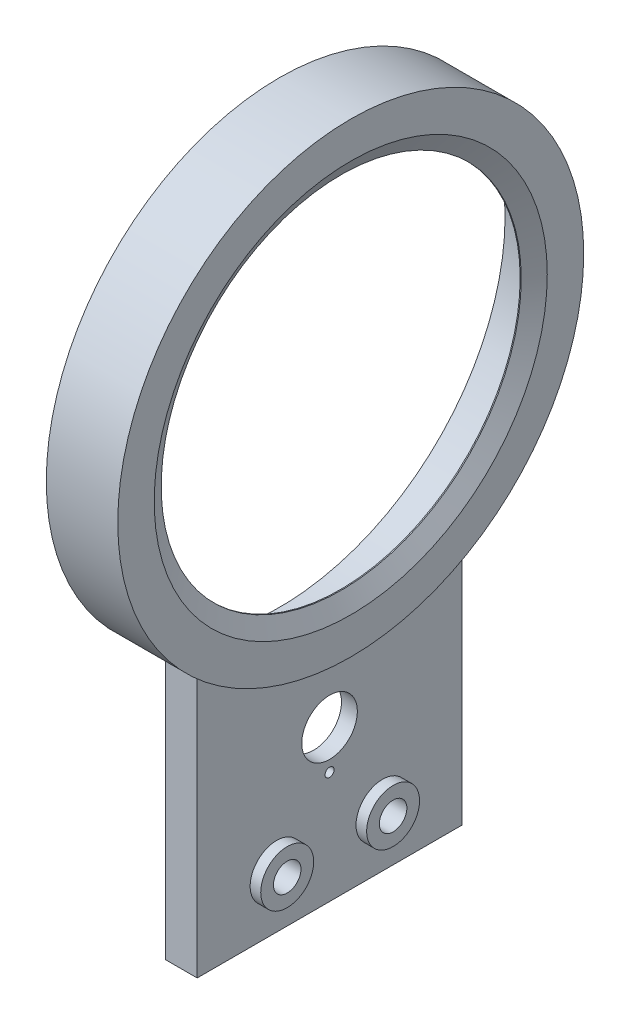
ISO-10303-21;
HEADER;
FILE_DESCRIPTION(('STEP AP214'),'2;1');
FILE_NAME('part.step','',(''),(''),'','','');
FILE_SCHEMA(('AUTOMOTIVE_DESIGN { 1 0 10303 214 1 1 1 1 }'));
ENDSEC;
DATA;
#1=APPLICATION_CONTEXT('core data for automotive mechanical design processes');
#2=APPLICATION_PROTOCOL_DEFINITION('international standard','automotive_design',2000,#1);
#3=PRODUCT_CONTEXT('',#1,'mechanical');
#4=PRODUCT('Part','Part','',(#3));
#5=PRODUCT_RELATED_PRODUCT_CATEGORY('part','',(#4));
#6=PRODUCT_DEFINITION_FORMATION('','',#4);
#7=PRODUCT_DEFINITION_CONTEXT('part definition',#1,'design');
#8=PRODUCT_DEFINITION('design','',#6,#7);
#9=PRODUCT_DEFINITION_SHAPE('','',#8);
#10=(LENGTH_UNIT() NAMED_UNIT(*) SI_UNIT(.MILLI.,.METRE.));
#11=(NAMED_UNIT(*) PLANE_ANGLE_UNIT() SI_UNIT($,.RADIAN.));
#12=(NAMED_UNIT(*) SI_UNIT($,.STERADIAN.) SOLID_ANGLE_UNIT());
#13=UNCERTAINTY_MEASURE_WITH_UNIT(LENGTH_MEASURE(1.E-05),#10,'distance_accuracy_value','');
#14=(GEOMETRIC_REPRESENTATION_CONTEXT(3) GLOBAL_UNCERTAINTY_ASSIGNED_CONTEXT((#13)) GLOBAL_UNIT_ASSIGNED_CONTEXT((#10,
#11,#12)) REPRESENTATION_CONTEXT('',''));
#15=CARTESIAN_POINT('',(0.,0.,0.));
#16=DIRECTION('',(0.,0.,1.));
#17=DIRECTION('',(1.,0.,0.));
#18=AXIS2_PLACEMENT_3D('',#15,#16,#17);
#19=CARTESIAN_POINT('',(-12.,-64.86,0.));
#20=DIRECTION('',(1.,0.,0.));
#21=DIRECTION('',(0.,0.,-1.));
#22=AXIS2_PLACEMENT_3D('',#19,#20,#21);
#23=CYLINDRICAL_SURFACE('',#22,0.850000000000002);
#24=CARTESIAN_POINT('',(-2.,-64.86,0.));
#25=DIRECTION('',(1.,0.,0.));
#26=DIRECTION('',(0.,0.,-1.));
#27=AXIS2_PLACEMENT_3D('',#24,#25,#26);
#28=CIRCLE('',#27,0.850000000000002);
#29=CARTESIAN_POINT('',(-2.,-64.86,-0.85000000000001));
#30=VERTEX_POINT('',#29);
#31=EDGE_CURVE('E161',#30,#30,#28,.T.);
#32=ORIENTED_EDGE('',*,*,#31,.T.);
#33=EDGE_LOOP('',(#32));
#34=FACE_BOUND('',#33,.T.);
#35=CARTESIAN_POINT('',(-5.,-64.86,0.));
#36=DIRECTION('',(-1.,0.,0.));
#37=DIRECTION('',(0.,0.,1.));
#38=AXIS2_PLACEMENT_3D('',#35,#36,#37);
#39=CIRCLE('',#38,0.850000000000002);
#40=CARTESIAN_POINT('',(-5.,-64.86,0.849999999999994));
#41=VERTEX_POINT('',#40);
#42=EDGE_CURVE('E137',#41,#41,#39,.F.);
#43=ORIENTED_EDGE('',*,*,#42,.F.);
#44=EDGE_LOOP('',(#43));
#45=FACE_BOUND('',#44,.T.);
#46=ADVANCED_FACE('F43',(#34,#45),#23,.F.);
#47=CARTESIAN_POINT('',(-12.,-57.5,0.));
#48=DIRECTION('',(1.,0.,0.));
#49=DIRECTION('',(0.,0.,-1.));
#50=AXIS2_PLACEMENT_3D('',#47,#48,#49);
#51=CYLINDRICAL_SURFACE('',#50,5.25);
#52=CARTESIAN_POINT('',(-2.,-57.5,0.));
#53=DIRECTION('',(1.,0.,0.));
#54=DIRECTION('',(0.,0.,-1.));
#55=AXIS2_PLACEMENT_3D('',#52,#53,#54);
#56=CIRCLE('',#55,5.25);
#57=CARTESIAN_POINT('',(-2.,-57.5,-5.25000000000001));
#58=VERTEX_POINT('',#57);
#59=EDGE_CURVE('E157',#58,#58,#56,.T.);
#60=ORIENTED_EDGE('',*,*,#59,.T.);
#61=EDGE_LOOP('',(#60));
#62=FACE_BOUND('',#61,.T.);
#63=CARTESIAN_POINT('',(-5.,-57.5,0.));
#64=DIRECTION('',(-1.,0.,0.));
#65=DIRECTION('',(0.,0.,1.));
#66=AXIS2_PLACEMENT_3D('',#63,#64,#65);
#67=CIRCLE('',#66,5.25);
#68=CARTESIAN_POINT('',(-5.,-57.5,5.24999999999999));
#69=VERTEX_POINT('',#68);
#70=EDGE_CURVE('E134',#69,#69,#67,.F.);
#71=ORIENTED_EDGE('',*,*,#70,.F.);
#72=EDGE_LOOP('',(#71));
#73=FACE_BOUND('',#72,.T.);
#74=ADVANCED_FACE('F179',(#62,#73),#51,.F.);
#75=CARTESIAN_POINT('',(0.,0.,0.));
#76=DIRECTION('',(1.,0.,0.));
#77=DIRECTION('',(0.,0.,-1.));
#78=AXIS2_PLACEMENT_3D('',#75,#76,#77);
#79=PLANE('',#78);
#80=CARTESIAN_POINT('',(0.,0.,0.));
#81=DIRECTION('',(1.,0.,0.));
#82=DIRECTION('',(0.,0.,-1.));
#83=AXIS2_PLACEMENT_3D('',#80,#81,#82);
#84=CIRCLE('',#83,34.);
#85=CARTESIAN_POINT('',(0.,0.,-34.));
#86=VERTEX_POINT('',#85);
#87=EDGE_CURVE('E119',#86,#86,#84,.T.);
#88=ORIENTED_EDGE('',*,*,#87,.T.);
#89=EDGE_LOOP('',(#88));
#90=FACE_BOUND('',#89,.T.);
#91=CARTESIAN_POINT('',(0.,0.,0.));
#92=DIRECTION('',(-1.,0.,0.));
#93=DIRECTION('',(0.,0.,1.));
#94=AXIS2_PLACEMENT_3D('',#91,#92,#93);
#95=CIRCLE('',#94,39.5);
#96=CARTESIAN_POINT('',(0.,0.,39.5));
#97=VERTEX_POINT('',#96);
#98=EDGE_CURVE('E225',#97,#97,#95,.T.);
#99=ORIENTED_EDGE('',*,*,#98,.T.);
#100=EDGE_LOOP('',(#99));
#101=FACE_BOUND('',#100,.T.);
#102=ADVANCED_FACE('F185',(#90,#101),#79,.F.);
#103=CARTESIAN_POINT('',(-11.5,0.,0.));
#104=DIRECTION('',(1.,0.,0.));
#105=DIRECTION('',(0.,0.,-1.));
#106=AXIS2_PLACEMENT_3D('',#103,#104,#105);
#107=CYLINDRICAL_SURFACE('',#106,44.);
#108=CARTESIAN_POINT('',(-11.5,0.,0.));
#109=DIRECTION('',(1.,0.,0.));
#110=DIRECTION('',(0.,0.,-1.));
#111=AXIS2_PLACEMENT_3D('',#108,#109,#110);
#112=CIRCLE('',#111,44.);
#113=CARTESIAN_POINT('',(-11.5,0.,-44.));
#114=VERTEX_POINT('',#113);
#115=EDGE_CURVE('E130',#114,#114,#112,.T.);
#116=ORIENTED_EDGE('',*,*,#115,.T.);
#117=EDGE_LOOP('',(#116));
#118=FACE_BOUND('',#117,.T.);
#119=CARTESIAN_POINT('',(2.,0.,0.));
#120=DIRECTION('',(1.,0.,0.));
#121=DIRECTION('',(0.,0.,-1.));
#122=AXIS2_PLACEMENT_3D('',#119,#120,#121);
#123=CIRCLE('',#122,44.);
#124=CARTESIAN_POINT('',(2.,0.,-44.));
#125=VERTEX_POINT('',#124);
#126=EDGE_CURVE('E122',#125,#125,#123,.T.);
#127=ORIENTED_EDGE('',*,*,#126,.F.);
#128=EDGE_LOOP('',(#127));
#129=FACE_BOUND('',#128,.T.);
#130=DIRECTION('',(1.,0.,0.));
#131=VECTOR('',#130,1.);
#132=CARTESIAN_POINT('',(-8.,-36.2077339804633,-25.));
#133=LINE('',#132,#131);
#134=CARTESIAN_POINT('',(-8.,-36.2077339804633,-25.));
#135=VERTEX_POINT('',#134);
#136=CARTESIAN_POINT('',(-2.,-36.2077339804633,-25.));
#137=VERTEX_POINT('',#136);
#138=EDGE_CURVE('E59',#135,#137,#133,.T.);
#139=ORIENTED_EDGE('',*,*,#138,.F.);
#140=CARTESIAN_POINT('',(-8.,0.,0.));
#141=DIRECTION('',(1.,0.,0.));
#142=DIRECTION('',(0.,0.,-1.));
#143=AXIS2_PLACEMENT_3D('',#140,#141,#142);
#144=CIRCLE('',#143,44.);
#145=CARTESIAN_POINT('',(-8.,-36.2077339804633,25.));
#146=VERTEX_POINT('',#145);
#147=EDGE_CURVE('E63',#146,#135,#144,.T.);
#148=ORIENTED_EDGE('',*,*,#147,.F.);
#149=DIRECTION('',(1.,0.,0.));
#150=VECTOR('',#149,1.);
#151=CARTESIAN_POINT('',(-8.,-36.2077339804633,25.));
#152=LINE('',#151,#150);
#153=CARTESIAN_POINT('',(-2.,-36.2077339804633,25.));
#154=VERTEX_POINT('',#153);
#155=EDGE_CURVE('E95',#146,#154,#152,.T.);
#156=ORIENTED_EDGE('',*,*,#155,.T.);
#157=CARTESIAN_POINT('',(-2.,0.,0.));
#158=DIRECTION('',(1.,0.,0.));
#159=DIRECTION('',(0.,0.,-1.));
#160=AXIS2_PLACEMENT_3D('',#157,#158,#159);
#161=CIRCLE('',#160,44.);
#162=EDGE_CURVE('E109',#154,#137,#161,.T.);
#163=ORIENTED_EDGE('',*,*,#162,.T.);
#164=EDGE_LOOP('',(#139,#148,#156,#163));
#165=FACE_BOUND('',#164,.T.);
#166=ADVANCED_FACE('F164',(#118,#129,#165),#107,.T.);
#167=CARTESIAN_POINT('',(-11.5,0.,0.));
#168=DIRECTION('',(1.,0.,0.));
#169=DIRECTION('',(0.,0.,-1.));
#170=AXIS2_PLACEMENT_3D('',#167,#168,#169);
#171=CYLINDRICAL_SURFACE('',#170,42.65);
#172=CARTESIAN_POINT('',(-1.,0.,0.));
#173=DIRECTION('',(-1.,0.,0.));
#174=DIRECTION('',(0.,0.,1.));
#175=AXIS2_PLACEMENT_3D('',#172,#173,#174);
#176=CIRCLE('',#175,42.65);
#177=CARTESIAN_POINT('',(-1.,0.,42.65));
#178=VERTEX_POINT('',#177);
#179=EDGE_CURVE('E112',#178,#178,#176,.T.);
#180=ORIENTED_EDGE('',*,*,#179,.F.);
#181=EDGE_LOOP('',(#180));
#182=FACE_BOUND('',#181,.T.);
#183=CARTESIAN_POINT('',(-11.5,0.,0.));
#184=DIRECTION('',(1.,0.,0.));
#185=DIRECTION('',(0.,0.,-1.));
#186=AXIS2_PLACEMENT_3D('',#183,#184,#185);
#187=CIRCLE('',#186,42.65);
#188=CARTESIAN_POINT('',(-11.5,0.,-42.65));
#189=VERTEX_POINT('',#188);
#190=EDGE_CURVE('E125',#189,#189,#187,.T.);
#191=ORIENTED_EDGE('',*,*,#190,.F.);
#192=EDGE_LOOP('',(#191));
#193=FACE_BOUND('',#192,.T.);
#194=ADVANCED_FACE('F239',(#182,#193),#171,.F.);
#195=CARTESIAN_POINT('',(-11.5,0.,0.));
#196=DIRECTION('',(1.,0.,0.));
#197=DIRECTION('',(0.,0.,-1.));
#198=AXIS2_PLACEMENT_3D('',#195,#196,#197);
#199=PLANE('',#198);
#200=ORIENTED_EDGE('',*,*,#190,.T.);
#201=EDGE_LOOP('',(#200));
#202=FACE_BOUND('',#201,.T.);
#203=ORIENTED_EDGE('',*,*,#115,.F.);
#204=EDGE_LOOP('',(#203));
#205=FACE_BOUND('',#204,.T.);
#206=ADVANCED_FACE('F242',(#202,#205),#199,.F.);
#207=CARTESIAN_POINT('',(2.,0.,0.));
#208=DIRECTION('',(-1.,0.,0.));
#209=DIRECTION('',(0.,0.,1.));
#210=AXIS2_PLACEMENT_3D('',#207,#208,#209);
#211=CYLINDRICAL_SURFACE('',#210,34.);
#212=CARTESIAN_POINT('',(0.200000000000018,0.,0.));
#213=DIRECTION('',(1.,0.,0.));
#214=DIRECTION('',(0.,0.,-1.));
#215=AXIS2_PLACEMENT_3D('',#212,#213,#214);
#216=CIRCLE('',#215,34.);
#217=CARTESIAN_POINT('',(0.200000000000018,0.,-34.));
#218=VERTEX_POINT('',#217);
#219=EDGE_CURVE('E133',#218,#218,#216,.T.);
#220=ORIENTED_EDGE('',*,*,#219,.T.);
#221=EDGE_LOOP('',(#220));
#222=FACE_BOUND('',#221,.T.);
#223=ORIENTED_EDGE('',*,*,#87,.F.);
#224=EDGE_LOOP('',(#223));
#225=FACE_BOUND('',#224,.T.);
#226=ADVANCED_FACE('F175',(#222,#225),#211,.F.);
#227=CARTESIAN_POINT('',(2.,0.,0.));
#228=DIRECTION('',(1.,0.,0.));
#229=DIRECTION('',(0.,0.,-1.));
#230=AXIS2_PLACEMENT_3D('',#227,#228,#229);
#231=PLANE('',#230);
#232=CARTESIAN_POINT('',(2.,0.,0.));
#233=DIRECTION('',(1.,0.,0.));
#234=DIRECTION('',(0.,0.,-1.));
#235=AXIS2_PLACEMENT_3D('',#232,#233,#234);
#236=CIRCLE('',#235,37.117691453624);
#237=CARTESIAN_POINT('',(2.,0.,-37.117691453624));
#238=VERTEX_POINT('',#237);
#239=EDGE_CURVE('E141',#238,#238,#236,.F.);
#240=ORIENTED_EDGE('',*,*,#239,.T.);
#241=EDGE_LOOP('',(#240));
#242=FACE_BOUND('',#241,.T.);
#243=ORIENTED_EDGE('',*,*,#126,.T.);
#244=EDGE_LOOP('',(#243));
#245=FACE_BOUND('',#244,.T.);
#246=ADVANCED_FACE('F168',(#242,#245),#231,.T.);
#247=CARTESIAN_POINT('',(-8.,0.,-25.));
#248=DIRECTION('',(0.,0.,-1.));
#249=DIRECTION('',(-1.,0.,0.));
#250=AXIS2_PLACEMENT_3D('',#247,#248,#249);
#251=PLANE('',#250);
#252=DIRECTION('',(0.,1.,0.));
#253=VECTOR('',#252,1.);
#254=CARTESIAN_POINT('',(-2.,0.,-25.));
#255=LINE('',#254,#253);
#256=CARTESIAN_POINT('',(-2.,-86.,-25.));
#257=VERTEX_POINT('',#256);
#258=EDGE_CURVE('E115',#257,#137,#255,.T.);
#259=ORIENTED_EDGE('',*,*,#258,.F.);
#260=DIRECTION('',(1.,0.,0.));
#261=VECTOR('',#260,1.);
#262=CARTESIAN_POINT('',(-8.,-86.,-25.));
#263=LINE('',#262,#261);
#264=CARTESIAN_POINT('',(-8.,-86.,-25.));
#265=VERTEX_POINT('',#264);
#266=EDGE_CURVE('E94',#265,#257,#263,.T.);
#267=ORIENTED_EDGE('',*,*,#266,.F.);
#268=DIRECTION('',(0.,1.,0.));
#269=VECTOR('',#268,1.);
#270=CARTESIAN_POINT('',(-8.,0.,-25.));
#271=LINE('',#270,#269);
#272=EDGE_CURVE('E104',#265,#135,#271,.T.);
#273=ORIENTED_EDGE('',*,*,#272,.T.);
#274=ORIENTED_EDGE('',*,*,#138,.T.);
#275=EDGE_LOOP('',(#259,#267,#273,#274));
#276=FACE_BOUND('',#275,.T.);
#277=ADVANCED_FACE('F166',(#276),#251,.T.);
#278=CARTESIAN_POINT('',(-8.,-86.,0.));
#279=DIRECTION('',(0.,-1.,0.));
#280=DIRECTION('',(0.,0.,-1.));
#281=AXIS2_PLACEMENT_3D('',#278,#279,#280);
#282=PLANE('',#281);
#283=DIRECTION('',(0.,0.,-1.));
#284=VECTOR('',#283,1.);
#285=CARTESIAN_POINT('',(-2.,-86.,0.));
#286=LINE('',#285,#284);
#287=CARTESIAN_POINT('',(-2.,-86.,25.));
#288=VERTEX_POINT('',#287);
#289=EDGE_CURVE('E90',#288,#257,#286,.T.);
#290=ORIENTED_EDGE('',*,*,#289,.F.);
#291=DIRECTION('',(1.,0.,0.));
#292=VECTOR('',#291,1.);
#293=CARTESIAN_POINT('',(-8.,-86.,25.));
#294=LINE('',#293,#292);
#295=CARTESIAN_POINT('',(-8.,-86.,25.));
#296=VERTEX_POINT('',#295);
#297=EDGE_CURVE('E83',#296,#288,#294,.T.);
#298=ORIENTED_EDGE('',*,*,#297,.F.);
#299=DIRECTION('',(0.,0.,-1.));
#300=VECTOR('',#299,1.);
#301=CARTESIAN_POINT('',(-8.,-86.,0.));
#302=LINE('',#301,#300);
#303=EDGE_CURVE('E87',#296,#265,#302,.T.);
#304=ORIENTED_EDGE('',*,*,#303,.T.);
#305=ORIENTED_EDGE('',*,*,#266,.T.);
#306=EDGE_LOOP('',(#290,#298,#304,#305));
#307=FACE_BOUND('',#306,.T.);
#308=ADVANCED_FACE('F85',(#307),#282,.T.);
#309=CARTESIAN_POINT('',(-8.,0.,25.));
#310=DIRECTION('',(0.,0.,-1.));
#311=DIRECTION('',(-1.,0.,0.));
#312=AXIS2_PLACEMENT_3D('',#309,#310,#311);
#313=PLANE('',#312);
#314=DIRECTION('',(0.,1.,0.));
#315=VECTOR('',#314,1.);
#316=CARTESIAN_POINT('',(-2.,0.,25.));
#317=LINE('',#316,#315);
#318=EDGE_CURVE('E111',#288,#154,#317,.T.);
#319=ORIENTED_EDGE('',*,*,#318,.T.);
#320=ORIENTED_EDGE('',*,*,#155,.F.);
#321=DIRECTION('',(0.,1.,0.));
#322=VECTOR('',#321,1.);
#323=CARTESIAN_POINT('',(-8.,0.,25.));
#324=LINE('',#323,#322);
#325=EDGE_CURVE('E98',#296,#146,#324,.T.);
#326=ORIENTED_EDGE('',*,*,#325,.F.);
#327=ORIENTED_EDGE('',*,*,#297,.T.);
#328=EDGE_LOOP('',(#319,#320,#326,#327));
#329=FACE_BOUND('',#328,.T.);
#330=ADVANCED_FACE('F99',(#329),#313,.F.);
#331=CARTESIAN_POINT('',(-8.,0.,0.));
#332=DIRECTION('',(1.,0.,0.));
#333=DIRECTION('',(0.,0.,-1.));
#334=AXIS2_PLACEMENT_3D('',#331,#332,#333);
#335=PLANE('',#334);
#336=CARTESIAN_POINT('',(-8.,-57.5,0.));
#337=DIRECTION('',(-1.,0.,0.));
#338=DIRECTION('',(0.,0.,1.));
#339=AXIS2_PLACEMENT_3D('',#336,#337,#338);
#340=CIRCLE('',#339,12.5);
#341=CARTESIAN_POINT('',(-8.,-57.5,12.5));
#342=VERTEX_POINT('',#341);
#343=EDGE_CURVE('E216',#342,#342,#340,.T.);
#344=ORIENTED_EDGE('',*,*,#343,.F.);
#345=EDGE_LOOP('',(#344));
#346=FACE_BOUND('',#345,.T.);
#347=CARTESIAN_POINT('',(-8.,-76.,9.99999999999999));
#348=DIRECTION('',(1.,0.,0.));
#349=DIRECTION('',(0.,0.,-1.));
#350=AXIS2_PLACEMENT_3D('',#347,#348,#349);
#351=CIRCLE('',#350,2.6);
#352=CARTESIAN_POINT('',(-8.,-76.,7.39999999999999));
#353=VERTEX_POINT('',#352);
#354=EDGE_CURVE('E220',#353,#353,#351,.T.);
#355=ORIENTED_EDGE('',*,*,#354,.T.);
#356=EDGE_LOOP('',(#355));
#357=FACE_BOUND('',#356,.T.);
#358=CARTESIAN_POINT('',(-8.,-76.,-10.));
#359=DIRECTION('',(1.,0.,0.));
#360=DIRECTION('',(0.,0.,-1.));
#361=AXIS2_PLACEMENT_3D('',#358,#359,#360);
#362=CIRCLE('',#361,2.6);
#363=CARTESIAN_POINT('',(-8.,-76.,-12.6));
#364=VERTEX_POINT('',#363);
#365=EDGE_CURVE('E223',#364,#364,#362,.T.);
#366=ORIENTED_EDGE('',*,*,#365,.T.);
#367=EDGE_LOOP('',(#366));
#368=FACE_BOUND('',#367,.T.);
#369=ORIENTED_EDGE('',*,*,#147,.T.);
#370=ORIENTED_EDGE('',*,*,#272,.F.);
#371=ORIENTED_EDGE('',*,*,#303,.F.);
#372=ORIENTED_EDGE('',*,*,#325,.T.);
#373=EDGE_LOOP('',(#369,#370,#371,#372));
#374=FACE_BOUND('',#373,.T.);
#375=ADVANCED_FACE('F102',(#346,#357,#368,#374),#335,.F.);
#376=CARTESIAN_POINT('',(-2.,0.,0.));
#377=DIRECTION('',(1.,0.,0.));
#378=DIRECTION('',(0.,0.,-1.));
#379=AXIS2_PLACEMENT_3D('',#376,#377,#378);
#380=PLANE('',#379);
#381=CARTESIAN_POINT('',(-2.,-76.,9.99999999999999));
#382=DIRECTION('',(1.,0.,0.));
#383=DIRECTION('',(0.,0.,-1.));
#384=AXIS2_PLACEMENT_3D('',#381,#382,#383);
#385=CIRCLE('',#384,5.);
#386=CARTESIAN_POINT('',(-2.,-76.,4.99999999999999));
#387=VERTEX_POINT('',#386);
#388=EDGE_CURVE('E11',#387,#387,#385,.T.);
#389=ORIENTED_EDGE('',*,*,#388,.F.);
#390=EDGE_LOOP('',(#389));
#391=FACE_BOUND('',#390,.T.);
#392=CARTESIAN_POINT('',(-2.,-76.,-10.));
#393=DIRECTION('',(1.,0.,0.));
#394=DIRECTION('',(0.,0.,-1.));
#395=AXIS2_PLACEMENT_3D('',#392,#393,#394);
#396=CIRCLE('',#395,5.);
#397=CARTESIAN_POINT('',(-2.,-76.,-15.));
#398=VERTEX_POINT('',#397);
#399=EDGE_CURVE('E52',#398,#398,#396,.T.);
#400=ORIENTED_EDGE('',*,*,#399,.F.);
#401=EDGE_LOOP('',(#400));
#402=FACE_BOUND('',#401,.T.);
#403=ORIENTED_EDGE('',*,*,#59,.F.);
#404=EDGE_LOOP('',(#403));
#405=FACE_BOUND('',#404,.T.);
#406=ORIENTED_EDGE('',*,*,#31,.F.);
#407=EDGE_LOOP('',(#406));
#408=FACE_BOUND('',#407,.T.);
#409=ORIENTED_EDGE('',*,*,#162,.F.);
#410=ORIENTED_EDGE('',*,*,#318,.F.);
#411=ORIENTED_EDGE('',*,*,#289,.T.);
#412=ORIENTED_EDGE('',*,*,#258,.T.);
#413=EDGE_LOOP('',(#409,#410,#411,#412));
#414=FACE_BOUND('',#413,.T.);
#415=ADVANCED_FACE('F148',(#391,#402,#405,#408,#414),#380,.T.);
#416=CARTESIAN_POINT('',(-1.,0.,0.));
#417=DIRECTION('',(-1.,0.,0.));
#418=DIRECTION('',(0.,0.,1.));
#419=AXIS2_PLACEMENT_3D('',#416,#417,#418);
#420=PLANE('',#419);
#421=ORIENTED_EDGE('',*,*,#179,.T.);
#422=EDGE_LOOP('',(#421));
#423=FACE_BOUND('',#422,.T.);
#424=CARTESIAN_POINT('',(-1.,0.,0.));
#425=DIRECTION('',(-1.,0.,0.));
#426=DIRECTION('',(0.,0.,1.));
#427=AXIS2_PLACEMENT_3D('',#424,#425,#426);
#428=CIRCLE('',#427,39.5);
#429=CARTESIAN_POINT('',(-1.,0.,39.5));
#430=VERTEX_POINT('',#429);
#431=EDGE_CURVE('E230',#430,#430,#428,.T.);
#432=ORIENTED_EDGE('',*,*,#431,.F.);
#433=EDGE_LOOP('',(#432));
#434=FACE_BOUND('',#433,.T.);
#435=ADVANCED_FACE('F151',(#423,#434),#420,.T.);
#436=CARTESIAN_POINT('',(-1.,0.,0.));
#437=DIRECTION('',(1.,0.,0.));
#438=DIRECTION('',(0.,0.,-1.));
#439=AXIS2_PLACEMENT_3D('',#436,#437,#438);
#440=CYLINDRICAL_SURFACE('',#439,39.5);
#441=ORIENTED_EDGE('',*,*,#431,.T.);
#442=EDGE_LOOP('',(#441));
#443=FACE_BOUND('',#442,.T.);
#444=ORIENTED_EDGE('',*,*,#98,.F.);
#445=EDGE_LOOP('',(#444));
#446=FACE_BOUND('',#445,.T.);
#447=ADVANCED_FACE('F199',(#443,#446),#440,.F.);
#448=CARTESIAN_POINT('',(-12.,-76.,-10.));
#449=DIRECTION('',(1.,0.,0.));
#450=DIRECTION('',(0.,0.,-1.));
#451=AXIS2_PLACEMENT_3D('',#448,#449,#450);
#452=CYLINDRICAL_SURFACE('',#451,2.6);
#453=ORIENTED_EDGE('',*,*,#365,.F.);
#454=EDGE_LOOP('',(#453));
#455=FACE_BOUND('',#454,.T.);
#456=CARTESIAN_POINT('',(0.,-76.,-10.));
#457=DIRECTION('',(-1.,0.,0.));
#458=DIRECTION('',(0.,0.,1.));
#459=AXIS2_PLACEMENT_3D('',#456,#457,#458);
#460=CIRCLE('',#459,2.6);
#461=CARTESIAN_POINT('',(0.,-76.,-7.40000000000001));
#462=VERTEX_POINT('',#461);
#463=EDGE_CURVE('E311',#462,#462,#460,.T.);
#464=ORIENTED_EDGE('',*,*,#463,.F.);
#465=EDGE_LOOP('',(#464));
#466=FACE_BOUND('',#465,.T.);
#467=ADVANCED_FACE('F195',(#455,#466),#452,.F.);
#468=CARTESIAN_POINT('',(-12.,-76.,9.99999999999999));
#469=DIRECTION('',(1.,0.,0.));
#470=DIRECTION('',(0.,0.,-1.));
#471=AXIS2_PLACEMENT_3D('',#468,#469,#470);
#472=CYLINDRICAL_SURFACE('',#471,2.6);
#473=ORIENTED_EDGE('',*,*,#354,.F.);
#474=EDGE_LOOP('',(#473));
#475=FACE_BOUND('',#474,.T.);
#476=CARTESIAN_POINT('',(0.,-76.,9.99999999999999));
#477=DIRECTION('',(-1.,0.,0.));
#478=DIRECTION('',(0.,0.,1.));
#479=AXIS2_PLACEMENT_3D('',#476,#477,#478);
#480=CIRCLE('',#479,2.6);
#481=CARTESIAN_POINT('',(0.,-76.,12.6));
#482=VERTEX_POINT('',#481);
#483=EDGE_CURVE('E307',#482,#482,#480,.T.);
#484=ORIENTED_EDGE('',*,*,#483,.F.);
#485=EDGE_LOOP('',(#484));
#486=FACE_BOUND('',#485,.T.);
#487=ADVANCED_FACE('F191',(#475,#486),#472,.F.);
#488=CARTESIAN_POINT('',(-5.,-57.5,0.));
#489=DIRECTION('',(-1.,0.,0.));
#490=DIRECTION('',(0.,0.,1.));
#491=AXIS2_PLACEMENT_3D('',#488,#489,#490);
#492=PLANE('',#491);
#493=CARTESIAN_POINT('',(-5.,-57.5,0.));
#494=DIRECTION('',(-1.,0.,0.));
#495=DIRECTION('',(0.,0.,1.));
#496=AXIS2_PLACEMENT_3D('',#493,#494,#495);
#497=CIRCLE('',#496,12.5);
#498=CARTESIAN_POINT('',(-5.,-57.5,12.5));
#499=VERTEX_POINT('',#498);
#500=EDGE_CURVE('E138',#499,#499,#497,.T.);
#501=ORIENTED_EDGE('',*,*,#500,.T.);
#502=EDGE_LOOP('',(#501));
#503=FACE_BOUND('',#502,.T.);
#504=ORIENTED_EDGE('',*,*,#70,.T.);
#505=EDGE_LOOP('',(#504));
#506=FACE_BOUND('',#505,.T.);
#507=ORIENTED_EDGE('',*,*,#42,.T.);
#508=EDGE_LOOP('',(#507));
#509=FACE_BOUND('',#508,.T.);
#510=ADVANCED_FACE('F194',(#503,#506,#509),#492,.T.);
#511=CARTESIAN_POINT('',(-5.,-57.5,0.));
#512=DIRECTION('',(-1.,0.,0.));
#513=DIRECTION('',(0.,0.,1.));
#514=AXIS2_PLACEMENT_3D('',#511,#512,#513);
#515=CYLINDRICAL_SURFACE('',#514,12.5);
#516=ORIENTED_EDGE('',*,*,#500,.F.);
#517=EDGE_LOOP('',(#516));
#518=FACE_BOUND('',#517,.T.);
#519=ORIENTED_EDGE('',*,*,#343,.T.);
#520=EDGE_LOOP('',(#519));
#521=FACE_BOUND('',#520,.T.);
#522=ADVANCED_FACE('F273',(#518,#521),#515,.F.);
#523=CARTESIAN_POINT('',(0.200000000000018,0.,0.));
#524=DIRECTION('',(1.,0.,0.));
#525=DIRECTION('',(0.,0.,-1.));
#526=AXIS2_PLACEMENT_3D('',#523,#524,#525);
#527=CONICAL_SURFACE('',#526,34.,1.0471975511966);
#528=ORIENTED_EDGE('',*,*,#239,.F.);
#529=EDGE_LOOP('',(#528));
#530=FACE_BOUND('',#529,.T.);
#531=ORIENTED_EDGE('',*,*,#219,.F.);
#532=EDGE_LOOP('',(#531));
#533=FACE_BOUND('',#532,.T.);
#534=ADVANCED_FACE('F46',(#530,#533),#527,.F.);
#535=CARTESIAN_POINT('',(0.,-76.,-10.));
#536=DIRECTION('',(-1.,0.,0.));
#537=DIRECTION('',(0.,0.,1.));
#538=AXIS2_PLACEMENT_3D('',#535,#536,#537);
#539=CYLINDRICAL_SURFACE('',#538,5.);
#540=CARTESIAN_POINT('',(0.,-76.,-10.));
#541=DIRECTION('',(-1.,0.,0.));
#542=DIRECTION('',(0.,0.,1.));
#543=AXIS2_PLACEMENT_3D('',#540,#541,#542);
#544=CIRCLE('',#543,5.);
#545=CARTESIAN_POINT('',(0.,-76.,-5.00000000000001));
#546=VERTEX_POINT('',#545);
#547=EDGE_CURVE('E314',#546,#546,#544,.T.);
#548=ORIENTED_EDGE('',*,*,#547,.T.);
#549=EDGE_LOOP('',(#548));
#550=FACE_BOUND('',#549,.T.);
#551=ORIENTED_EDGE('',*,*,#399,.T.);
#552=EDGE_LOOP('',(#551));
#553=FACE_BOUND('',#552,.T.);
#554=ADVANCED_FACE('F146',(#550,#553),#539,.T.);
#555=CARTESIAN_POINT('',(0.,-76.,-10.));
#556=DIRECTION('',(-1.,0.,0.));
#557=DIRECTION('',(0.,0.,1.));
#558=AXIS2_PLACEMENT_3D('',#555,#556,#557);
#559=PLANE('',#558);
#560=ORIENTED_EDGE('',*,*,#463,.T.);
#561=EDGE_LOOP('',(#560));
#562=FACE_BOUND('',#561,.T.);
#563=ORIENTED_EDGE('',*,*,#547,.F.);
#564=EDGE_LOOP('',(#563));
#565=FACE_BOUND('',#564,.T.);
#566=ADVANCED_FACE('F279',(#562,#565),#559,.F.);
#567=CARTESIAN_POINT('',(0.,-76.,9.99999999999999));
#568=DIRECTION('',(-1.,0.,0.));
#569=DIRECTION('',(0.,0.,1.));
#570=AXIS2_PLACEMENT_3D('',#567,#568,#569);
#571=CYLINDRICAL_SURFACE('',#570,5.);
#572=CARTESIAN_POINT('',(0.,-76.,9.99999999999999));
#573=DIRECTION('',(-1.,0.,0.));
#574=DIRECTION('',(0.,0.,1.));
#575=AXIS2_PLACEMENT_3D('',#572,#573,#574);
#576=CIRCLE('',#575,5.);
#577=CARTESIAN_POINT('',(0.,-76.,15.));
#578=VERTEX_POINT('',#577);
#579=EDGE_CURVE('E310',#578,#578,#576,.T.);
#580=ORIENTED_EDGE('',*,*,#579,.T.);
#581=EDGE_LOOP('',(#580));
#582=FACE_BOUND('',#581,.T.);
#583=ORIENTED_EDGE('',*,*,#388,.T.);
#584=EDGE_LOOP('',(#583));
#585=FACE_BOUND('',#584,.T.);
#586=ADVANCED_FACE('F294',(#582,#585),#571,.T.);
#587=CARTESIAN_POINT('',(0.,-76.,9.99999999999999));
#588=DIRECTION('',(-1.,0.,0.));
#589=DIRECTION('',(0.,0.,1.));
#590=AXIS2_PLACEMENT_3D('',#587,#588,#589);
#591=PLANE('',#590);
#592=ORIENTED_EDGE('',*,*,#483,.T.);
#593=EDGE_LOOP('',(#592));
#594=FACE_BOUND('',#593,.T.);
#595=ORIENTED_EDGE('',*,*,#579,.F.);
#596=EDGE_LOOP('',(#595));
#597=FACE_BOUND('',#596,.T.);
#598=ADVANCED_FACE('F298',(#594,#597),#591,.F.);
#599=CLOSED_SHELL('',(#46,#74,#102,#166,#194,#206,#226,#246,#277,#308,#330,#375,#415,#435,#447,
#467,#487,#510,#522,#534,#554,#566,#586,#598));
#600=MANIFOLD_SOLID_BREP('B2',#599);
#601=ADVANCED_BREP_SHAPE_REPRESENTATION('',(#18,#600),#14);
#602=SHAPE_DEFINITION_REPRESENTATION(#9,#601);
ENDSEC;
END-ISO-10303-21;
